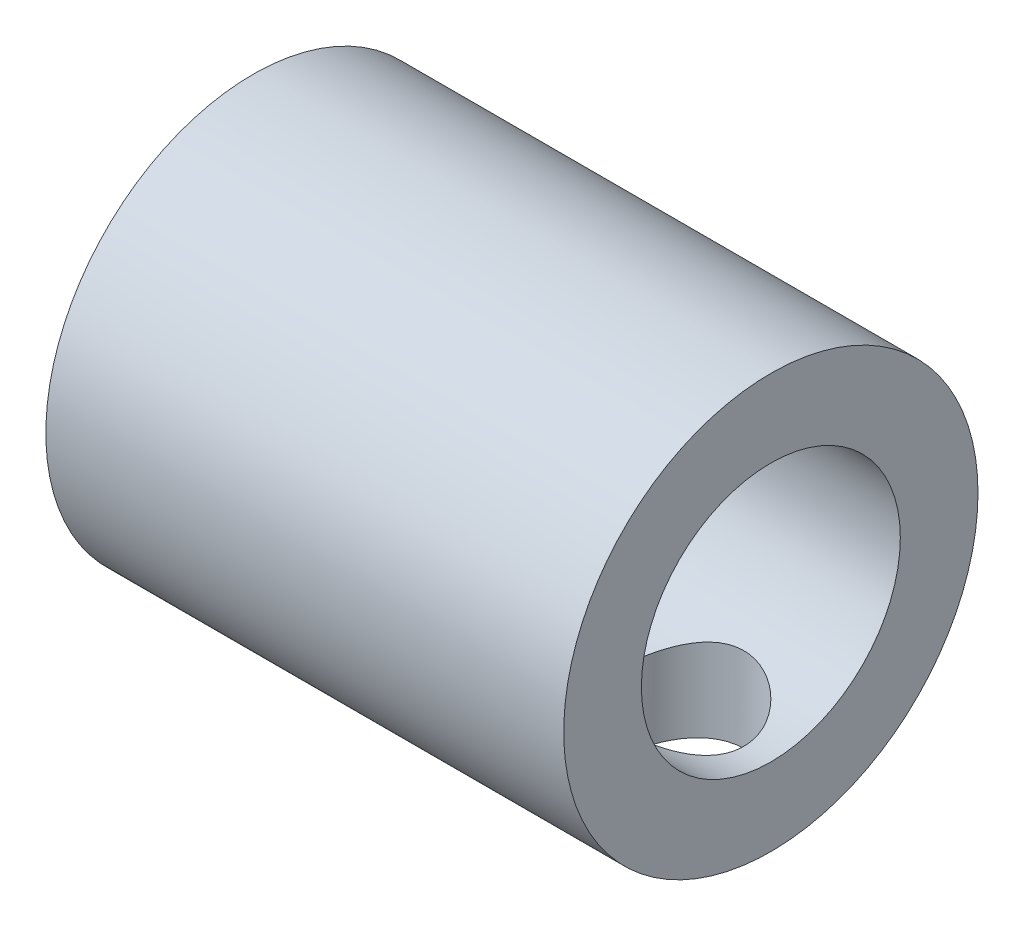
ISO-10303-21;
HEADER;
FILE_DESCRIPTION(('STEP AP214'),'2;1');
FILE_NAME('part.step','',(''),(''),'','','');
FILE_SCHEMA(('AUTOMOTIVE_DESIGN { 1 0 10303 214 1 1 1 1 }'));
ENDSEC;
DATA;
#1=APPLICATION_CONTEXT('core data for automotive mechanical design processes');
#2=APPLICATION_PROTOCOL_DEFINITION('international standard','automotive_design',2000,#1);
#3=PRODUCT_CONTEXT('',#1,'mechanical');
#4=PRODUCT('Part','Part','',(#3));
#5=PRODUCT_RELATED_PRODUCT_CATEGORY('part','',(#4));
#6=PRODUCT_DEFINITION_FORMATION('','',#4);
#7=PRODUCT_DEFINITION_CONTEXT('part definition',#1,'design');
#8=PRODUCT_DEFINITION('design','',#6,#7);
#9=PRODUCT_DEFINITION_SHAPE('','',#8);
#10=(LENGTH_UNIT() NAMED_UNIT(*) SI_UNIT(.MILLI.,.METRE.));
#11=(NAMED_UNIT(*) PLANE_ANGLE_UNIT() SI_UNIT($,.RADIAN.));
#12=(NAMED_UNIT(*) SI_UNIT($,.STERADIAN.) SOLID_ANGLE_UNIT());
#13=UNCERTAINTY_MEASURE_WITH_UNIT(LENGTH_MEASURE(1.E-05),#10,'distance_accuracy_value','');
#14=(GEOMETRIC_REPRESENTATION_CONTEXT(3) GLOBAL_UNCERTAINTY_ASSIGNED_CONTEXT((#13)) GLOBAL_UNIT_ASSIGNED_CONTEXT((#10,
#11,#12)) REPRESENTATION_CONTEXT('',''));
#15=CARTESIAN_POINT('',(0.,0.,0.));
#16=DIRECTION('',(0.,0.,1.));
#17=DIRECTION('',(1.,0.,0.));
#18=AXIS2_PLACEMENT_3D('',#15,#16,#17);
#19=CARTESIAN_POINT('',(19.05,0.,0.));
#20=DIRECTION('',(1.,0.,0.));
#21=DIRECTION('',(0.,0.,-1.));
#22=AXIS2_PLACEMENT_3D('',#19,#20,#21);
#23=PLANE('',#22);
#24=CARTESIAN_POINT('',(19.05,0.,0.));
#25=DIRECTION('',(1.,0.,0.));
#26=DIRECTION('',(0.,0.,-1.));
#27=AXIS2_PLACEMENT_3D('',#24,#25,#26);
#28=CIRCLE('',#27,7.62);
#29=CARTESIAN_POINT('',(19.05,0.,-7.62));
#30=VERTEX_POINT('',#29);
#31=EDGE_CURVE('E10',#30,#30,#28,.T.);
#32=ORIENTED_EDGE('',*,*,#31,.T.);
#33=EDGE_LOOP('',(#32));
#34=FACE_BOUND('',#33,.T.);
#35=CARTESIAN_POINT('',(19.05,0.,0.));
#36=DIRECTION('',(1.,0.,0.));
#37=DIRECTION('',(0.,0.,-1.));
#38=AXIS2_PLACEMENT_3D('',#35,#36,#37);
#39=CIRCLE('',#38,4.7625);
#40=CARTESIAN_POINT('',(19.05,0.,-4.7625));
#41=VERTEX_POINT('',#40);
#42=EDGE_CURVE('E57',#41,#41,#39,.T.);
#43=ORIENTED_EDGE('',*,*,#42,.F.);
#44=EDGE_LOOP('',(#43));
#45=FACE_BOUND('',#44,.T.);
#46=ADVANCED_FACE('F37',(#34,#45),#23,.T.);
#47=CARTESIAN_POINT('',(0.,0.,0.));
#48=DIRECTION('',(1.,0.,0.));
#49=DIRECTION('',(0.,0.,-1.));
#50=AXIS2_PLACEMENT_3D('',#47,#48,#49);
#51=PLANE('',#50);
#52=CARTESIAN_POINT('',(0.,0.,0.));
#53=DIRECTION('',(1.,0.,0.));
#54=DIRECTION('',(0.,0.,-1.));
#55=AXIS2_PLACEMENT_3D('',#52,#53,#54);
#56=CIRCLE('',#55,7.62);
#57=CARTESIAN_POINT('',(0.,0.,-7.62));
#58=VERTEX_POINT('',#57);
#59=EDGE_CURVE('E51',#58,#58,#56,.T.);
#60=ORIENTED_EDGE('',*,*,#59,.F.);
#61=EDGE_LOOP('',(#60));
#62=FACE_BOUND('',#61,.T.);
#63=CARTESIAN_POINT('',(0.,0.,0.));
#64=DIRECTION('',(1.,0.,0.));
#65=DIRECTION('',(0.,0.,-1.));
#66=AXIS2_PLACEMENT_3D('',#63,#64,#65);
#67=CIRCLE('',#66,4.7625);
#68=CARTESIAN_POINT('',(0.,0.,-4.7625));
#69=VERTEX_POINT('',#68);
#70=EDGE_CURVE('E60',#69,#69,#67,.T.);
#71=ORIENTED_EDGE('',*,*,#70,.T.);
#72=EDGE_LOOP('',(#71));
#73=FACE_BOUND('',#72,.T.);
#74=ADVANCED_FACE('F117',(#62,#73),#51,.F.);
#75=CARTESIAN_POINT('',(19.05,0.,0.));
#76=DIRECTION('',(-1.,0.,0.));
#77=DIRECTION('',(0.,0.,1.));
#78=AXIS2_PLACEMENT_3D('',#75,#76,#77);
#79=CYLINDRICAL_SURFACE('',#78,7.62);
#80=CARTESIAN_POINT('',(15.6547620241357,-7.2316569010912,2.40157));
#81=CARTESIAN_POINT('',(15.5235123130258,-7.23165757530995,2.4015692861996));
#82=CARTESIAN_POINT('',(15.3922551570497,-7.2352691320312,2.39077397112568));
#83=CARTESIAN_POINT('',(15.1336010585991,-7.24925990417747,2.34800420392578));
#84=CARTESIAN_POINT('',(15.0062051155259,-7.25964085633853,2.31602431671534));
#85=CARTESIAN_POINT('',(14.7590579275832,-7.28588038652905,2.23209747606729));
#86=CARTESIAN_POINT('',(14.6392934224892,-7.3017291383105,2.18018632257967));
#87=CARTESIAN_POINT('',(14.4101393807919,-7.33710478282479,2.05799034046863));
#88=CARTESIAN_POINT('',(14.300751741256,-7.35663234616598,1.98770216100078));
#89=CARTESIAN_POINT('',(14.0916340240188,-7.39793070134593,1.82811686647243));
#90=CARTESIAN_POINT('',(13.9923198689654,-7.41975297171269,1.73828792688283));
#91=CARTESIAN_POINT('',(13.809886439531,-7.46274426040211,1.54330865599299));
#92=CARTESIAN_POINT('',(13.7267694670486,-7.48391318551388,1.43815615065611));
#93=CARTESIAN_POINT('',(13.5772479809904,-7.52380236174444,1.21251921370837));
#94=CARTESIAN_POINT('',(13.5112727337024,-7.54245494318521,1.0917373082636));
#95=CARTESIAN_POINT('',(13.4007355247955,-7.57460797504549,0.840103457455955));
#96=CARTESIAN_POINT('',(13.3561684389002,-7.5881096582292,0.709253930596315));
#97=CARTESIAN_POINT('',(13.2911040835944,-7.60807521449745,0.445554843688627));
#98=CARTESIAN_POINT('',(13.2698957289214,-7.61474653990451,0.312896729523261));
#99=CARTESIAN_POINT('',(13.2498968541454,-7.62103285113675,0.0457484363947419));
#100=CARTESIAN_POINT('',(13.2511011532985,-7.62064946767668,-0.0887413119991221));
#101=CARTESIAN_POINT('',(13.2754277068528,-7.61301352561399,-0.350726962753624));
#102=CARTESIAN_POINT('',(13.2977789291064,-7.60600261891733,-0.478302630996912));
#103=CARTESIAN_POINT('',(13.3624984992005,-7.58619736252481,-0.72779012120892));
#104=CARTESIAN_POINT('',(13.4048681598808,-7.57340263351943,-0.849701571133543));
#105=CARTESIAN_POINT('',(13.5089115680807,-7.54314505865111,-1.08616731716624));
#106=CARTESIAN_POINT('',(13.5708174616053,-7.52562646467348,-1.20061204296498));
#107=CARTESIAN_POINT('',(13.7119892148195,-7.48776418964819,-1.417727329937));
#108=CARTESIAN_POINT('',(13.791259521608,-7.46741978538798,-1.52039486464068));
#109=CARTESIAN_POINT('',(13.9688594661558,-7.42505182844192,-1.71563777922218));
#110=CARTESIAN_POINT('',(14.0678541344059,-7.40299365211314,-1.80760155755668));
#111=CARTESIAN_POINT('',(14.280064714218,-7.36042571820712,-1.9738067120483));
#112=CARTESIAN_POINT('',(14.393282358632,-7.33991614979236,-2.04804592553636));
#113=CARTESIAN_POINT('',(14.6324790673459,-7.30259103494319,-2.1774226164346));
#114=CARTESIAN_POINT('',(14.7585903644601,-7.28582086663922,-2.23232968422538));
#115=CARTESIAN_POINT('',(15.0189255494924,-7.25840462096032,-2.31993403256562));
#116=CARTESIAN_POINT('',(15.1531464435342,-7.24775629862317,-2.35263945554946));
#117=CARTESIAN_POINT('',(15.4200229327347,-7.23428891232488,-2.3937241057069));
#118=CARTESIAN_POINT('',(15.5525189774043,-7.23116815120871,-2.40304136480111));
#119=CARTESIAN_POINT('',(15.8171917608044,-7.23227087882186,-2.39972153001498));
#120=CARTESIAN_POINT('',(15.9493685466187,-7.23649320879759,-2.38708790002655));
#121=CARTESIAN_POINT('',(16.2055842956226,-7.25150813656239,-2.34106381778757));
#122=CARTESIAN_POINT('',(16.3297483219741,-7.26210273548497,-2.30829826743386));
#123=CARTESIAN_POINT('',(16.5708011632955,-7.28845766937781,-2.22367612798571));
#124=CARTESIAN_POINT('',(16.6876887746134,-7.3042188563085,-2.17181639012256));
#125=CARTESIAN_POINT('',(16.9146318011424,-7.33969970122808,-2.04875842109818));
#126=CARTESIAN_POINT('',(17.024389828929,-7.35952111226841,-1.97704184733698));
#127=CARTESIAN_POINT('',(17.2306548611169,-7.40068003750117,-1.81690886569533));
#128=CARTESIAN_POINT('',(17.3271583530097,-7.42201795130874,-1.72848804580835));
#129=CARTESIAN_POINT('',(17.5083831915685,-7.46489681146138,-1.53301228039229));
#130=CARTESIAN_POINT('',(17.5924342287143,-7.48640822642613,-1.42532774028445));
#131=CARTESIAN_POINT('',(17.7413014627521,-7.52631056441096,-1.19686113751878));
#132=CARTESIAN_POINT('',(17.8061185207988,-7.54470162712142,-1.07607966157505));
#133=CARTESIAN_POINT('',(17.9140582801864,-7.57618802463557,-0.825576787171212));
#134=CARTESIAN_POINT('',(17.9573365515243,-7.58932119696737,-0.695927424792104));
#135=CARTESIAN_POINT('',(18.0213265221091,-7.60897822732166,-0.430702341440734));
#136=CARTESIAN_POINT('',(18.0420454165736,-7.61550419263816,-0.295128524406051));
#137=CARTESIAN_POINT('',(18.0597359944666,-7.62106944269963,-0.0280682086409427));
#138=CARTESIAN_POINT('',(18.0576751232541,-7.62041374048082,0.103348599273581));
#139=CARTESIAN_POINT('',(18.0322100691029,-7.6124224632146,0.363878531840488));
#140=CARTESIAN_POINT('',(18.0088073185497,-7.60508733646476,0.492991810504041));
#141=CARTESIAN_POINT('',(17.9419423208434,-7.58465988589069,0.743608980929515));
#142=CARTESIAN_POINT('',(17.8987429065353,-7.57164309972481,0.865189583414237));
#143=CARTESIAN_POINT('',(17.7937489148968,-7.54119424625989,1.0994343912265));
#144=CARTESIAN_POINT('',(17.7319511223707,-7.52376141561943,1.21209705060734));
#145=CARTESIAN_POINT('',(17.5890630641861,-7.48555217726166,1.42951609865919));
#146=CARTESIAN_POINT('',(17.5073834773055,-7.4646815524761,1.53386845044852));
#147=CARTESIAN_POINT('',(17.3280851161899,-7.42221641465043,1.72770615825599));
#148=CARTESIAN_POINT('',(17.2304615334794,-7.40062168479702,1.81718701277193));
#149=CARTESIAN_POINT('',(17.0180845007126,-7.35828361485506,1.98180276473949));
#150=CARTESIAN_POINT('',(16.902862870715,-7.3375938805401,2.05634914752775));
#151=CARTESIAN_POINT('',(16.6609018829419,-7.30033791662725,2.18494224941049));
#152=CARTESIAN_POINT('',(16.5341670098945,-7.28377009075371,2.23899690851693));
#153=CARTESIAN_POINT('',(16.2832307883932,-7.25792925973285,2.32133114342325));
#154=CARTESIAN_POINT('',(16.1596423494372,-7.24817753151309,2.35133109685426));
#155=CARTESIAN_POINT('',(15.9089583348776,-7.23504184509588,2.39144831238661));
#156=CARTESIAN_POINT('',(15.7818636703676,-7.23165624818071,2.40157069124119));
#157=CARTESIAN_POINT('',(15.6547620241357,-7.2316569010912,2.40157));
#158=B_SPLINE_CURVE_WITH_KNOTS('',3,(#80,#81,#82,#83,#84,#85,#86,#87,#88,#89,#90,#91,#92,#93,
#94,#95,#96,#97,#98,#99,#100,#101,#102,#103,#104,#105,#106,#107,#108,#109,#110,#111,#112,#113,
#114,#115,#116,#117,#118,#119,#120,#121,#122,#123,#124,#125,#126,#127,#128,#129,#130,#131,#132,
#133,#134,#135,#136,#137,#138,#139,#140,#141,#142,#143,#144,#145,#146,#147,#148,#149,#150,#151,
#152,#153,#154,#155,#156,#157),.UNSPECIFIED.,.T.,.F.,(4,2,2,2,2,2,2,2,2,2,2,2,2,2,2,2,2,2,2,2,2,
2,2,2,2,2,2,2,2,2,2,2,2,2,2,2,2,2,4),(0.,0.393279481879848,0.786659902096411,1.17933702477095,
1.57208579770669,1.97728128370375,2.38253431303161,2.79712613355468,3.21161866749915,
3.61311105365864,4.01451063494936,4.40181692762377,4.78914862396225,5.18126817049041,
5.57348825812992,5.98232016604903,6.39120193227372,6.80480394291387,7.21825418329799,
7.61483630510809,8.01135585119124,8.39614891277432,8.78100545793964,9.17704972261003,
9.57319873903231,9.98609000119937,10.3989627743761,10.8088085350846,11.2185235389035,
11.6109074035293,12.0032649347838,12.3905578090832,12.7779176751587,13.1785715475754,
13.5793464752148,13.993694996235,14.4078828034404,14.7888310077436,15.1696811380291),.UNSPECIFIED.);
#159=CARTESIAN_POINT('',(15.6547620241357,-7.2316569010912,2.40157));
#160=VERTEX_POINT('',#159);
#161=EDGE_CURVE('E69',#160,#160,#158,.T.);
#162=ORIENTED_EDGE('',*,*,#161,.F.);
#163=EDGE_LOOP('',(#162));
#164=FACE_BOUND('',#163,.T.);
#165=CARTESIAN_POINT('',(3.39523797586428,-7.2316569010912,2.40157));
#166=CARTESIAN_POINT('',(3.26398826475439,-7.23165757530995,2.4015692861996));
#167=CARTESIAN_POINT('',(3.13273110877825,-7.2352691320312,2.39077397112569));
#168=CARTESIAN_POINT('',(2.87407701032768,-7.24925990417747,2.34800420392578));
#169=CARTESIAN_POINT('',(2.7466810672544,-7.25964085633852,2.31602431671534));
#170=CARTESIAN_POINT('',(2.49953387931178,-7.28588038652905,2.2320974760673));
#171=CARTESIAN_POINT('',(2.37976937421779,-7.3017291383105,2.18018632257967));
#172=CARTESIAN_POINT('',(2.15061533252048,-7.33710478282479,2.05799034046863));
#173=CARTESIAN_POINT('',(2.04122769298458,-7.35663234616598,1.98770216100078));
#174=CARTESIAN_POINT('',(1.83210997574736,-7.39793070134593,1.82811686647243));
#175=CARTESIAN_POINT('',(1.73279582069397,-7.41975297171269,1.73828792688283));
#176=CARTESIAN_POINT('',(1.5503623912595,-7.46274426040211,1.54330865599299));
#177=CARTESIAN_POINT('',(1.46724541877713,-7.48391318551388,1.43815615065611));
#178=CARTESIAN_POINT('',(1.31772393271898,-7.52380236174444,1.21251921370837));
#179=CARTESIAN_POINT('',(1.25174868543089,-7.54245494318521,1.09173730826361));
#180=CARTESIAN_POINT('',(1.14121147652406,-7.57460797504549,0.840103457455959));
#181=CARTESIAN_POINT('',(1.09664439062872,-7.5881096582292,0.709253930596318));
#182=CARTESIAN_POINT('',(1.0315800353229,-7.60807521449745,0.445554843688631));
#183=CARTESIAN_POINT('',(1.01037168064993,-7.61474653990451,0.312896729523265));
#184=CARTESIAN_POINT('',(0.990372805873972,-7.62103285113674,0.0457484363947451));
#185=CARTESIAN_POINT('',(0.991577105027064,-7.62064946767668,-0.088741311999119));
#186=CARTESIAN_POINT('',(1.01590365858136,-7.61301352561399,-0.350726962753621));
#187=CARTESIAN_POINT('',(1.03825488083491,-7.60600261891733,-0.478302630996909));
#188=CARTESIAN_POINT('',(1.10297445092904,-7.58619736252481,-0.727790121208917));
#189=CARTESIAN_POINT('',(1.14534411160936,-7.57340263351943,-0.84970157113354));
#190=CARTESIAN_POINT('',(1.24938751980926,-7.54314505865111,-1.08616731716624));
#191=CARTESIAN_POINT('',(1.31129341333381,-7.52562646467348,-1.20061204296498));
#192=CARTESIAN_POINT('',(1.45246516654799,-7.48776418964819,-1.417727329937));
#193=CARTESIAN_POINT('',(1.53173547333653,-7.46741978538798,-1.52039486464068));
#194=CARTESIAN_POINT('',(1.70933541788431,-7.42505182844193,-1.71563777922218));
#195=CARTESIAN_POINT('',(1.80833008613443,-7.40299365211314,-1.80760155755667));
#196=CARTESIAN_POINT('',(2.02054066594658,-7.36042571820712,-1.97380671204829));
#197=CARTESIAN_POINT('',(2.13375831036058,-7.33991614979236,-2.04804592553636));
#198=CARTESIAN_POINT('',(2.37295501907448,-7.30259103494319,-2.17742261643459));
#199=CARTESIAN_POINT('',(2.49906631618859,-7.28582086663922,-2.23232968422537));
#200=CARTESIAN_POINT('',(2.75940150122096,-7.25840462096032,-2.31993403256562));
#201=CARTESIAN_POINT('',(2.89362239526271,-7.24775629862317,-2.35263945554946));
#202=CARTESIAN_POINT('',(3.16049888446319,-7.23428891232488,-2.3937241057069));
#203=CARTESIAN_POINT('',(3.29299492913281,-7.23116815120871,-2.40304136480111));
#204=CARTESIAN_POINT('',(3.55766771253292,-7.23227087882186,-2.39972153001498));
#205=CARTESIAN_POINT('',(3.68984449834719,-7.23649320879759,-2.38708790002655));
#206=CARTESIAN_POINT('',(3.94606024735111,-7.25150813656239,-2.34106381778757));
#207=CARTESIAN_POINT('',(4.07022427370267,-7.26210273548497,-2.30829826743386));
#208=CARTESIAN_POINT('',(4.31127711502409,-7.28845766937781,-2.22367612798571));
#209=CARTESIAN_POINT('',(4.42816472634198,-7.30421885630851,-2.17181639012256));
#210=CARTESIAN_POINT('',(4.65510775287092,-7.33969970122808,-2.04875842109818));
#211=CARTESIAN_POINT('',(4.76486578065751,-7.35952111226841,-1.97704184733698));
#212=CARTESIAN_POINT('',(4.97113081284548,-7.40068003750117,-1.81690886569532));
#213=CARTESIAN_POINT('',(5.06763430473821,-7.42201795130874,-1.72848804580835));
#214=CARTESIAN_POINT('',(5.248859143297,-7.46489681146138,-1.53301228039229));
#215=CARTESIAN_POINT('',(5.33291018044281,-7.48640822642613,-1.42532774028445));
#216=CARTESIAN_POINT('',(5.48177741448068,-7.52631056441096,-1.19686113751878));
#217=CARTESIAN_POINT('',(5.54659447252729,-7.54470162712142,-1.07607966157505));
#218=CARTESIAN_POINT('',(5.65453423191497,-7.57618802463558,-0.825576787171211));
#219=CARTESIAN_POINT('',(5.69781250325279,-7.58932119696737,-0.695927424792102));
#220=CARTESIAN_POINT('',(5.76180247383765,-7.60897822732166,-0.430702341440732));
#221=CARTESIAN_POINT('',(5.78252136830211,-7.61550419263816,-0.295128524406049));
#222=CARTESIAN_POINT('',(5.80021194619511,-7.62106944269963,-0.0280682086409414));
#223=CARTESIAN_POINT('',(5.79815107498267,-7.62041374048082,0.103348599273582));
#224=CARTESIAN_POINT('',(5.77268602083146,-7.6124224632146,0.363878531840489));
#225=CARTESIAN_POINT('',(5.74928327027829,-7.60508733646476,0.492991810504043));
#226=CARTESIAN_POINT('',(5.68241827257192,-7.58465988589068,0.743608980929517));
#227=CARTESIAN_POINT('',(5.63921885826386,-7.57164309972481,0.865189583414239));
#228=CARTESIAN_POINT('',(5.53422486662537,-7.54119424625989,1.0994343912265));
#229=CARTESIAN_POINT('',(5.47242707409919,-7.52376141561943,1.21209705060734));
#230=CARTESIAN_POINT('',(5.32953901591463,-7.48555217726166,1.42951609865919));
#231=CARTESIAN_POINT('',(5.24785942903401,-7.4646815524761,1.53386845044852));
#232=CARTESIAN_POINT('',(5.06856106791846,-7.42221641465043,1.72770615825599));
#233=CARTESIAN_POINT('',(4.97093748520798,-7.40062168479702,1.81718701277193));
#234=CARTESIAN_POINT('',(4.75856045244115,-7.35828361485506,1.98180276473949));
#235=CARTESIAN_POINT('',(4.64333882244357,-7.3375938805401,2.05634914752775));
#236=CARTESIAN_POINT('',(4.40137783467048,-7.30033791662725,2.18494224941049));
#237=CARTESIAN_POINT('',(4.27464296162307,-7.28377009075371,2.23899690851693));
#238=CARTESIAN_POINT('',(4.0237067401217,-7.25792925973285,2.32133114342325));
#239=CARTESIAN_POINT('',(3.90011830116573,-7.24817753151309,2.35133109685426));
#240=CARTESIAN_POINT('',(3.64943428660616,-7.23504184509588,2.39144831238661));
#241=CARTESIAN_POINT('',(3.52233962209611,-7.23165624818071,2.40157069124119));
#242=CARTESIAN_POINT('',(3.39523797586428,-7.2316569010912,2.40157));
#243=B_SPLINE_CURVE_WITH_KNOTS('',3,(#165,#166,#167,#168,#169,#170,#171,#172,#173,#174,#175,
#176,#177,#178,#179,#180,#181,#182,#183,#184,#185,#186,#187,#188,#189,#190,#191,#192,#193,#194,
#195,#196,#197,#198,#199,#200,#201,#202,#203,#204,#205,#206,#207,#208,#209,#210,#211,#212,#213,
#214,#215,#216,#217,#218,#219,#220,#221,#222,#223,#224,#225,#226,#227,#228,#229,#230,#231,#232,
#233,#234,#235,#236,#237,#238,#239,#240,#241,#242),.UNSPECIFIED.,.T.,.F.,(4,2,2,2,2,2,2,2,2,2,2,
2,2,2,2,2,2,2,2,2,2,2,2,2,2,2,2,2,2,2,2,2,2,2,2,2,2,2,4),(0.,0.393279481879846,
0.786659902096411,1.17933702477095,1.57208579770669,1.97728128370375,2.38253431303161,
2.79712613355468,3.21161866749914,3.61311105365864,4.01451063494936,4.40181692762377,
4.78914862396225,5.18126817049041,5.57348825812992,5.98232016604903,6.39120193227372,
6.80480394291387,7.21825418329799,7.61483630510809,8.01135585119124,8.39614891277432,
8.78100545793964,9.17704972261004,9.57319873903231,9.98609000119938,10.3989627743761,
10.8088085350846,11.2185235389035,11.6109074035293,12.0032649347838,12.3905578090832,
12.7779176751587,13.1785715475754,13.5793464752148,13.993694996235,14.4078828034404,
14.7888310077436,15.1696811380291),.UNSPECIFIED.);
#244=CARTESIAN_POINT('',(3.39523797586428,-7.2316569010912,2.40157));
#245=VERTEX_POINT('',#244);
#246=EDGE_CURVE('E84',#245,#245,#243,.T.);
#247=ORIENTED_EDGE('',*,*,#246,.F.);
#248=EDGE_LOOP('',(#247));
#249=FACE_BOUND('',#248,.T.);
#250=ORIENTED_EDGE('',*,*,#31,.F.);
#251=EDGE_LOOP('',(#250));
#252=FACE_BOUND('',#251,.T.);
#253=ORIENTED_EDGE('',*,*,#59,.T.);
#254=EDGE_LOOP('',(#253));
#255=FACE_BOUND('',#254,.T.);
#256=ADVANCED_FACE('F39',(#164,#249,#252,#255),#79,.T.);
#257=CARTESIAN_POINT('',(19.05,0.,0.));
#258=DIRECTION('',(-1.,0.,0.));
#259=DIRECTION('',(0.,0.,1.));
#260=AXIS2_PLACEMENT_3D('',#257,#258,#259);
#261=CYLINDRICAL_SURFACE('',#260,4.7625);
#262=CARTESIAN_POINT('',(15.6547620241357,-4.11264729646246,2.40157));
#263=CARTESIAN_POINT('',(15.7797327414817,-4.11265990386191,2.40155973343254));
#264=CARTESIAN_POINT('',(15.904862570746,-4.11843107601683,2.39174913306283));
#265=CARTESIAN_POINT('',(16.1512654797777,-4.14067833605372,2.35300972063427));
#266=CARTESIAN_POINT('',(16.2725300509991,-4.15717653129372,2.32404142429822));
#267=CARTESIAN_POINT('',(16.507174776247,-4.19847440133819,2.24856425984942));
#268=CARTESIAN_POINT('',(16.6205935793146,-4.22322927040106,2.20214989577611));
#269=CARTESIAN_POINT('',(16.8380049549129,-4.27818192319765,2.09338647536742));
#270=CARTESIAN_POINT('',(16.9419968793573,-4.30838008072491,2.03103632459004));
#271=CARTESIAN_POINT('',(17.1472429512737,-4.37391386224317,1.88603351890668));
#272=CARTESIAN_POINT('',(17.2475339252925,-4.4094679533935,1.8021156720658));
#273=CARTESIAN_POINT('',(17.4333691458058,-4.47994528104851,1.61898902562954));
#274=CARTESIAN_POINT('',(17.5189059278989,-4.51486819027589,1.51977253397656));
#275=CARTESIAN_POINT('',(17.6785722494883,-4.58302357740014,1.3005192878438));
#276=CARTESIAN_POINT('',(17.7515108721513,-4.61597410748031,1.17951935907143));
#277=CARTESIAN_POINT('',(17.8755565667117,-4.67362502727262,0.924993167748086));
#278=CARTESIAN_POINT('',(17.9266776480623,-4.69833070892753,0.79147501077859));
#279=CARTESIAN_POINT('',(18.0018021003719,-4.73513188356892,0.525912150724053));
#280=CARTESIAN_POINT('',(18.0274962463222,-4.74800875323345,0.394456497900129));
#281=CARTESIAN_POINT('',(18.0566116466018,-4.76262329962942,0.128518648629994));
#282=CARTESIAN_POINT('',(18.060046643583,-4.76436784937169,-0.00596162895283574));
#283=CARTESIAN_POINT('',(18.0451849093801,-4.75688618946571,-0.261394145301118));
#284=CARTESIAN_POINT('',(18.0287827335086,-4.74861632031125,-0.382491206366111));
#285=CARTESIAN_POINT('',(17.9781110529469,-4.72348764863764,-0.61994153601501));
#286=CARTESIAN_POINT('',(17.9438402092522,-4.70662820245304,-0.736294448387284));
#287=CARTESIAN_POINT('',(17.8581978192991,-4.66557286595072,-0.962962732430413));
#288=CARTESIAN_POINT('',(17.8065993390919,-4.64128001921897,-1.07317407246924));
#289=CARTESIAN_POINT('',(17.6880884933464,-4.58753718794867,-1.28363690207081));
#290=CARTESIAN_POINT('',(17.6211706779355,-4.55808536897708,-1.38388482889125));
#291=CARTESIAN_POINT('',(17.4665680206051,-4.49345237172379,-1.58181568832133));
#292=CARTESIAN_POINT('',(17.3775085323503,-4.45799262669823,-1.67833473601119));
#293=CARTESIAN_POINT('',(17.1848213229091,-4.38713127182797,-1.85570095523231));
#294=CARTESIAN_POINT('',(17.081182171334,-4.35172972985912,-1.93653571089703));
#295=CARTESIAN_POINT('',(16.853990244101,-4.28247292771516,-2.0854286345405));
#296=CARTESIAN_POINT('',(16.7295783126207,-4.24887029604746,-2.15230515441184));
#297=CARTESIAN_POINT('',(16.4691899052923,-4.19060329454031,-2.26367836306304));
#298=CARTESIAN_POINT('',(16.3332258391385,-4.16592947928741,-2.30819872091947));
#299=CARTESIAN_POINT('',(16.0649686215033,-4.13109096573778,-2.3699507263383));
#300=CARTESIAN_POINT('',(15.9332456916052,-4.11992712807873,-2.38907351888934));
#301=CARTESIAN_POINT('',(15.6680323901466,-4.11054014172593,-2.40519738387313));
#302=CARTESIAN_POINT('',(15.5345433894693,-4.11230748334903,-2.4022147128035));
#303=CARTESIAN_POINT('',(15.2855673869909,-4.12752241013554,-2.37594825601623));
#304=CARTESIAN_POINT('',(15.1697409967451,-4.13963725940766,-2.35497974084686));
#305=CARTESIAN_POINT('',(14.9434794031133,-4.17219849208994,-2.29679534450232));
#306=CARTESIAN_POINT('',(14.8330459979445,-4.19264763350041,-2.25957408464568));
#307=CARTESIAN_POINT('',(14.6148906987044,-4.24067633851834,-2.16814268544975));
#308=CARTESIAN_POINT('',(14.5075298138831,-4.26854168988831,-2.11322708128836));
#309=CARTESIAN_POINT('',(14.3029230229688,-4.32801739168789,-1.98857702850115));
#310=CARTESIAN_POINT('',(14.2056823605108,-4.35962966556243,-1.91883495415119));
#311=CARTESIAN_POINT('',(14.0109852391455,-4.42792453088005,-1.75602922294062));
#312=CARTESIAN_POINT('',(13.9151105454044,-4.46473619541053,-1.66111950837856));
#313=CARTESIAN_POINT('',(13.7401406727938,-4.53577384924057,-1.456001590404));
#314=CARTESIAN_POINT('',(13.6610514738785,-4.56999891425866,-1.34578795791449));
#315=CARTESIAN_POINT('',(13.5199959598131,-4.63324980318469,-1.10897238695807));
#316=CARTESIAN_POINT('',(13.4585739263369,-4.66210227971156,-0.981996642077774));
#317=CARTESIAN_POINT('',(13.358580370592,-4.71002966329481,-0.717640952815609));
#318=CARTESIAN_POINT('',(13.31998844827,-4.72911329732877,-0.580270420989705));
#319=CARTESIAN_POINT('',(13.270129374312,-4.75393790974862,-0.312775943589806));
#320=CARTESIAN_POINT('',(13.2566600840937,-4.76075213245241,-0.18316139467844));
#321=CARTESIAN_POINT('',(13.2509053313551,-4.76365219833973,0.0766383418903189));
#322=CARTESIAN_POINT('',(13.258612188946,-4.75974193094227,0.206823305579867));
#323=CARTESIAN_POINT('',(13.2935471271539,-4.74225719410205,0.454772334089721));
#324=CARTESIAN_POINT('',(13.3194172652188,-4.72935542506625,0.572780356487072));
#325=CARTESIAN_POINT('',(13.388092370318,-4.6958240319176,0.802580398626071));
#326=CARTESIAN_POINT('',(13.4308997267239,-4.67519331748683,0.914371538799182));
#327=CARTESIAN_POINT('',(13.534105895288,-4.62697353412022,1.13388118489093));
#328=CARTESIAN_POINT('',(13.5951717544569,-4.59912721904414,1.24122785321571));
#329=CARTESIAN_POINT('',(13.732325131013,-4.53936343688917,1.44458925725736));
#330=CARTESIAN_POINT('',(13.8084195244224,-4.50744410865458,1.54059877362465));
#331=CARTESIAN_POINT('',(13.9823831778412,-4.43888547226505,1.72879018882542));
#332=CARTESIAN_POINT('',(14.0816754465402,-4.40209505144754,1.81960615572185));
#333=CARTESIAN_POINT('',(14.2945504731571,-4.33058546598059,1.98380231634613));
#334=CARTESIAN_POINT('',(14.4081461073945,-4.29586820970008,2.05716662544833));
#335=CARTESIAN_POINT('',(14.6517029513726,-4.2315288119549,2.18655029023297));
#336=CARTESIAN_POINT('',(14.7820913556238,-4.20212184129791,2.24188970708983));
#337=CARTESIAN_POINT('',(14.9844904233046,-4.16637727212735,2.30722996624808));
#338=CARTESIAN_POINT('',(15.0530280333411,-4.15586244968508,2.32605620895804));
#339=CARTESIAN_POINT('',(15.1918845107208,-4.13804307049216,2.35761288921875));
#340=CARTESIAN_POINT('',(15.2622021044616,-4.13073628338909,2.37034756242144));
#341=CARTESIAN_POINT('',(15.3862647847557,-4.12106101817752,2.38711757389374));
#342=CARTESIAN_POINT('',(15.4397678033325,-4.11791530777297,2.39253061160143));
#343=CARTESIAN_POINT('',(15.5470913607907,-4.11370566056303,2.39975915769623));
#344=CARTESIAN_POINT('',(15.6009119208042,-4.11264186391172,2.40157442388209));
#345=CARTESIAN_POINT('',(15.6547620241357,-4.11264729646246,2.40157));
#346=B_SPLINE_CURVE_WITH_KNOTS('',3,(#262,#263,#264,#265,#266,#267,#268,#269,#270,#271,#272,
#273,#274,#275,#276,#277,#278,#279,#280,#281,#282,#283,#284,#285,#286,#287,#288,#289,#290,#291,
#292,#293,#294,#295,#296,#297,#298,#299,#300,#301,#302,#303,#304,#305,#306,#307,#308,#309,#310,
#311,#312,#313,#314,#315,#316,#317,#318,#319,#320,#321,#322,#323,#324,#325,#326,#327,#328,#329,
#330,#331,#332,#333,#334,#335,#336,#337,#338,#339,#340,#341,#342,#343,#344,#345),.UNSPECIFIED.,
.T.,.F.,(4,2,2,2,2,2,2,2,2,2,2,2,2,2,2,2,2,2,2,2,2,2,2,2,2,2,2,2,2,2,2,2,2,2,2,2,2,2,2,2,2,4),
(0.,0.374694285208094,0.750163237308487,1.12362694671722,1.49711631185667,1.90196830605358,
2.30702452493794,2.73996984713769,3.17263674720684,3.5740790757557,3.97527353282285,
4.3409964452638,4.7067467674176,5.0774872009893,5.44835973145605,5.85472979820406,
6.26142025136549,6.69471376533249,7.12754756734954,7.52590526083623,7.92397002864304,
8.27737312318114,8.63089326164492,9.00074668632337,9.37079080058487,9.78844279732706,
10.2062433367814,10.6357972235269,11.0649666964459,11.4543359035176,11.8435639178889,
12.2064216446868,12.5693305789037,12.9475781762975,13.3259992363447,13.7426400003269,
14.159658554975,14.5909565137399,14.806217877002,15.0213293441868,15.1827749068652,
15.3442313376571),.UNSPECIFIED.);
#347=CARTESIAN_POINT('',(15.6547620241357,-4.11264729646246,2.40157));
#348=VERTEX_POINT('',#347);
#349=EDGE_CURVE('E41',#348,#348,#346,.T.);
#350=ORIENTED_EDGE('',*,*,#349,.F.);
#351=EDGE_LOOP('',(#350));
#352=FACE_BOUND('',#351,.T.);
#353=CARTESIAN_POINT('',(3.39523797586428,-4.11264729646246,2.40157));
#354=CARTESIAN_POINT('',(3.52020869321022,-4.1126599038619,2.40155973343254));
#355=CARTESIAN_POINT('',(3.64533852247456,-4.11843107601682,2.39174913306283));
#356=CARTESIAN_POINT('',(3.89174143150628,-4.14067833605372,2.35300972063427));
#357=CARTESIAN_POINT('',(4.01300600272767,-4.15717653129372,2.32404142429822));
#358=CARTESIAN_POINT('',(4.24765072797554,-4.19847440133819,2.24856425984942));
#359=CARTESIAN_POINT('',(4.36106953104314,-4.22322927040106,2.20214989577611));
#360=CARTESIAN_POINT('',(4.57848090664146,-4.27818192319764,2.09338647536742));
#361=CARTESIAN_POINT('',(4.68247283108584,-4.3083800807249,2.03103632459004));
#362=CARTESIAN_POINT('',(4.88771890300227,-4.37391386224317,1.88603351890668));
#363=CARTESIAN_POINT('',(4.98800987702107,-4.4094679533935,1.8021156720658));
#364=CARTESIAN_POINT('',(5.17384509753435,-4.47994528104851,1.61898902562955));
#365=CARTESIAN_POINT('',(5.25938187962749,-4.51486819027589,1.51977253397656));
#366=CARTESIAN_POINT('',(5.41904820121685,-4.58302357740013,1.3005192878438));
#367=CARTESIAN_POINT('',(5.49198682387985,-4.61597410748031,1.17951935907143));
#368=CARTESIAN_POINT('',(5.61603251844026,-4.67362502727262,0.924993167748086));
#369=CARTESIAN_POINT('',(5.66715359979085,-4.69833070892753,0.79147501077859));
#370=CARTESIAN_POINT('',(5.74227805210046,-4.73513188356892,0.525912150724053));
#371=CARTESIAN_POINT('',(5.76797219805076,-4.74800875323345,0.394456497900129));
#372=CARTESIAN_POINT('',(5.79708759833032,-4.76262329962942,0.128518648629994));
#373=CARTESIAN_POINT('',(5.8005225953115,-4.76436784937169,-0.00596162895283588));
#374=CARTESIAN_POINT('',(5.78566086110859,-4.75688618946571,-0.261394145301118));
#375=CARTESIAN_POINT('',(5.76925868523711,-4.74861632031125,-0.382491206366111));
#376=CARTESIAN_POINT('',(5.71858700467546,-4.72348764863764,-0.61994153601501));
#377=CARTESIAN_POINT('',(5.68431616098071,-4.70662820245304,-0.736294448387284));
#378=CARTESIAN_POINT('',(5.59867377102767,-4.66557286595072,-0.962962732430412));
#379=CARTESIAN_POINT('',(5.54707529082044,-4.64128001921897,-1.07317407246924));
#380=CARTESIAN_POINT('',(5.42856444507493,-4.58753718794867,-1.28363690207081));
#381=CARTESIAN_POINT('',(5.36164662966407,-4.55808536897708,-1.38388482889125));
#382=CARTESIAN_POINT('',(5.20704397233365,-4.49345237172379,-1.58181568832133));
#383=CARTESIAN_POINT('',(5.11798448407881,-4.45799262669823,-1.67833473601119));
#384=CARTESIAN_POINT('',(4.92529727463759,-4.38713127182797,-1.85570095523231));
#385=CARTESIAN_POINT('',(4.8216581230625,-4.35172972985912,-1.93653571089703));
#386=CARTESIAN_POINT('',(4.59446619582956,-4.28247292771516,-2.0854286345405));
#387=CARTESIAN_POINT('',(4.47005426434922,-4.24887029604746,-2.15230515441184));
#388=CARTESIAN_POINT('',(4.20966585702081,-4.19060329454031,-2.26367836306304));
#389=CARTESIAN_POINT('',(4.07370179086706,-4.16592947928741,-2.30819872091947));
#390=CARTESIAN_POINT('',(3.80544457323183,-4.13109096573778,-2.3699507263383));
#391=CARTESIAN_POINT('',(3.67372164333377,-4.11992712807873,-2.38907351888934));
#392=CARTESIAN_POINT('',(3.40850834187512,-4.11054014172593,-2.40519738387313));
#393=CARTESIAN_POINT('',(3.27501934119783,-4.11230748334903,-2.40221471280349));
#394=CARTESIAN_POINT('',(3.02604333871948,-4.12752241013554,-2.37594825601623));
#395=CARTESIAN_POINT('',(2.91021694847367,-4.13963725940766,-2.35497974084686));
#396=CARTESIAN_POINT('',(2.68395535484182,-4.17219849208994,-2.29679534450232));
#397=CARTESIAN_POINT('',(2.57352194967309,-4.19264763350041,-2.25957408464568));
#398=CARTESIAN_POINT('',(2.35536665043293,-4.24067633851834,-2.16814268544975));
#399=CARTESIAN_POINT('',(2.24800576561166,-4.26854168988831,-2.11322708128836));
#400=CARTESIAN_POINT('',(2.04339897469735,-4.32801739168789,-1.98857702850115));
#401=CARTESIAN_POINT('',(1.94615831223934,-4.35962966556243,-1.91883495415119));
#402=CARTESIAN_POINT('',(1.75146119087408,-4.42792453088005,-1.75602922294062));
#403=CARTESIAN_POINT('',(1.65558649713294,-4.46473619541053,-1.66111950837855));
#404=CARTESIAN_POINT('',(1.48061662452235,-4.53577384924057,-1.456001590404));
#405=CARTESIAN_POINT('',(1.40152742560706,-4.56999891425866,-1.34578795791449));
#406=CARTESIAN_POINT('',(1.26047191154168,-4.63324980318469,-1.10897238695806));
#407=CARTESIAN_POINT('',(1.19904987806543,-4.66210227971156,-0.98199664207777));
#408=CARTESIAN_POINT('',(1.09905632232052,-4.71002966329481,-0.717640952815604));
#409=CARTESIAN_POINT('',(1.06046439999851,-4.72911329732877,-0.5802704209897));
#410=CARTESIAN_POINT('',(1.01060532604051,-4.75393790974862,-0.312775943589801));
#411=CARTESIAN_POINT('',(0.997136035822249,-4.76075213245241,-0.183161394678436));
#412=CARTESIAN_POINT('',(0.991381283083676,-4.76365219833973,0.0766383418903231));
#413=CARTESIAN_POINT('',(0.999088140674545,-4.75974193094227,0.206823305579872));
#414=CARTESIAN_POINT('',(1.03402307888246,-4.74225719410205,0.454772334089726));
#415=CARTESIAN_POINT('',(1.05989321694731,-4.72935542506625,0.572780356487077));
#416=CARTESIAN_POINT('',(1.12856832204653,-4.6958240319176,0.802580398626076));
#417=CARTESIAN_POINT('',(1.17137567845244,-4.67519331748683,0.914371538799187));
#418=CARTESIAN_POINT('',(1.27458184701649,-4.62697353412022,1.13388118489093));
#419=CARTESIAN_POINT('',(1.33564770618548,-4.59912721904414,1.24122785321571));
#420=CARTESIAN_POINT('',(1.47280108274151,-4.53936343688917,1.44458925725736));
#421=CARTESIAN_POINT('',(1.54889547615096,-4.50744410865458,1.54059877362465));
#422=CARTESIAN_POINT('',(1.7228591295697,-4.43888547226505,1.72879018882543));
#423=CARTESIAN_POINT('',(1.82215139826871,-4.40209505144754,1.81960615572186));
#424=CARTESIAN_POINT('',(2.03502642488569,-4.33058546598059,1.98380231634613));
#425=CARTESIAN_POINT('',(2.14862205912308,-4.29586820970008,2.05716662544834));
#426=CARTESIAN_POINT('',(2.39217890310112,-4.2315288119549,2.18655029023297));
#427=CARTESIAN_POINT('',(2.52256730735237,-4.20212184129791,2.24188970708983));
#428=CARTESIAN_POINT('',(2.72496637503312,-4.16637727212735,2.30722996624808));
#429=CARTESIAN_POINT('',(2.79350398506967,-4.15586244968508,2.32605620895804));
#430=CARTESIAN_POINT('',(2.93236046244939,-4.13804307049216,2.35761288921875));
#431=CARTESIAN_POINT('',(3.00267805619015,-4.13073628338909,2.37034756242145));
#432=CARTESIAN_POINT('',(3.12674073648425,-4.12106101817752,2.38711757389374));
#433=CARTESIAN_POINT('',(3.18024375506108,-4.11791530777297,2.39253061160143));
#434=CARTESIAN_POINT('',(3.28756731251923,-4.11370566056303,2.39975915769624));
#435=CARTESIAN_POINT('',(3.34138787253278,-4.11264186391172,2.40157442388209));
#436=CARTESIAN_POINT('',(3.39523797586428,-4.11264729646246,2.40157));
#437=B_SPLINE_CURVE_WITH_KNOTS('',3,(#353,#354,#355,#356,#357,#358,#359,#360,#361,#362,#363,
#364,#365,#366,#367,#368,#369,#370,#371,#372,#373,#374,#375,#376,#377,#378,#379,#380,#381,#382,
#383,#384,#385,#386,#387,#388,#389,#390,#391,#392,#393,#394,#395,#396,#397,#398,#399,#400,#401,
#402,#403,#404,#405,#406,#407,#408,#409,#410,#411,#412,#413,#414,#415,#416,#417,#418,#419,#420,
#421,#422,#423,#424,#425,#426,#427,#428,#429,#430,#431,#432,#433,#434,#435,#436),.UNSPECIFIED.,
.T.,.F.,(4,2,2,2,2,2,2,2,2,2,2,2,2,2,2,2,2,2,2,2,2,2,2,2,2,2,2,2,2,2,2,2,2,2,2,2,2,2,2,2,2,4),
(0.,0.374694285208093,0.750163237308488,1.12362694671723,1.49711631185667,1.90196830605359,
2.30702452493794,2.73996984713769,3.17263674720684,3.57407907575571,3.97527353282285,
4.3409964452638,4.7067467674176,5.0774872009893,5.44835973145605,5.85472979820406,
6.26142025136549,6.6947137653325,7.12754756734954,7.52590526083623,7.92397002864304,
8.27737312318114,8.63089326164493,9.00074668632337,9.37079080058487,9.78844279732706,
10.2062433367814,10.6357972235269,11.0649666964459,11.4543359035176,11.8435639178889,
12.2064216446868,12.5693305789037,12.9475781762975,13.3259992363447,13.7426400003269,
14.159658554975,14.5909565137399,14.806217877002,15.0213293441868,15.1827749068652,
15.3442313376571),.UNSPECIFIED.);
#438=CARTESIAN_POINT('',(3.39523797586428,-4.11264729646246,2.40157));
#439=VERTEX_POINT('',#438);
#440=EDGE_CURVE('E62',#439,#439,#437,.T.);
#441=ORIENTED_EDGE('',*,*,#440,.F.);
#442=EDGE_LOOP('',(#441));
#443=FACE_BOUND('',#442,.T.);
#444=ORIENTED_EDGE('',*,*,#42,.T.);
#445=EDGE_LOOP('',(#444));
#446=FACE_BOUND('',#445,.T.);
#447=ORIENTED_EDGE('',*,*,#70,.F.);
#448=EDGE_LOOP('',(#447));
#449=FACE_BOUND('',#448,.T.);
#450=ADVANCED_FACE('F70',(#352,#443,#446,#449),#261,.F.);
#451=CARTESIAN_POINT('',(3.39523797586428,-7.621,0.));
#452=DIRECTION('',(0.,1.,0.));
#453=DIRECTION('',(0.,0.,1.));
#454=AXIS2_PLACEMENT_3D('',#451,#452,#453);
#455=CYLINDRICAL_SURFACE('',#454,2.40157);
#456=ORIENTED_EDGE('',*,*,#440,.T.);
#457=EDGE_LOOP('',(#456));
#458=FACE_BOUND('',#457,.T.);
#459=ORIENTED_EDGE('',*,*,#246,.T.);
#460=EDGE_LOOP('',(#459));
#461=FACE_BOUND('',#460,.T.);
#462=ADVANCED_FACE('F74',(#458,#461),#455,.F.);
#463=CARTESIAN_POINT('',(15.6547620241357,-7.621,0.));
#464=DIRECTION('',(0.,1.,0.));
#465=DIRECTION('',(0.,0.,1.));
#466=AXIS2_PLACEMENT_3D('',#463,#464,#465);
#467=CYLINDRICAL_SURFACE('',#466,2.40157);
#468=ORIENTED_EDGE('',*,*,#349,.T.);
#469=EDGE_LOOP('',(#468));
#470=FACE_BOUND('',#469,.T.);
#471=ORIENTED_EDGE('',*,*,#161,.T.);
#472=EDGE_LOOP('',(#471));
#473=FACE_BOUND('',#472,.T.);
#474=ADVANCED_FACE('F78',(#470,#473),#467,.F.);
#475=CLOSED_SHELL('',(#46,#74,#256,#450,#462,#474));
#476=MANIFOLD_SOLID_BREP('B2',#475);
#477=ADVANCED_BREP_SHAPE_REPRESENTATION('',(#18,#476),#14);
#478=SHAPE_DEFINITION_REPRESENTATION(#9,#477);
ENDSEC;
END-ISO-10303-21;
